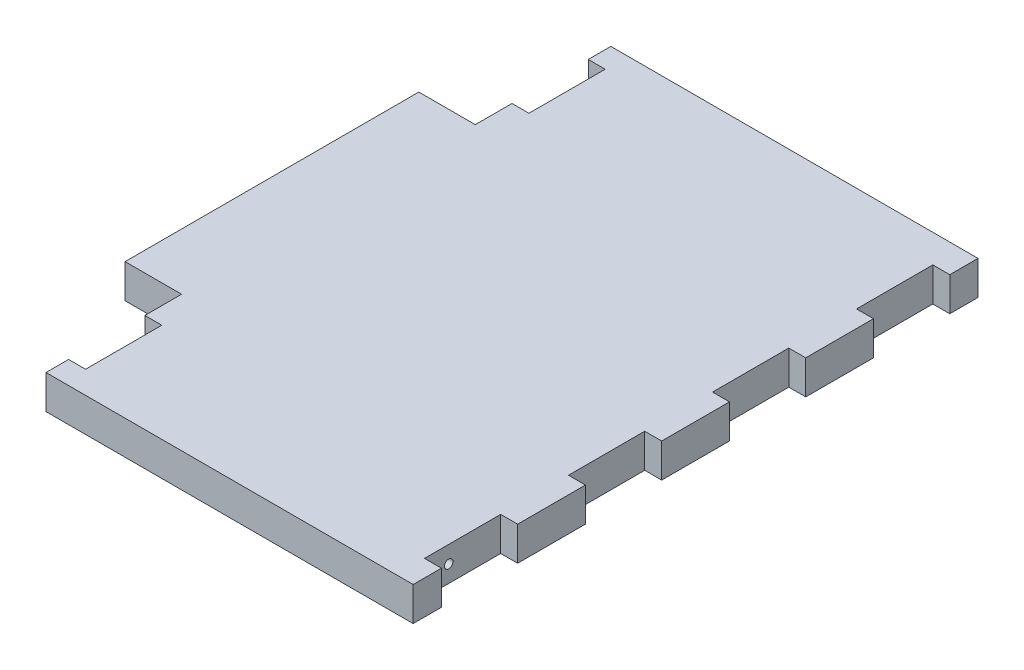
ISO-10303-21;
HEADER;
FILE_DESCRIPTION(('STEP AP214'),'2;1');
FILE_NAME('part.step','',(''),(''),'','','');
FILE_SCHEMA(('AUTOMOTIVE_DESIGN { 1 0 10303 214 1 1 1 1 }'));
ENDSEC;
DATA;
#1=APPLICATION_CONTEXT('core data for automotive mechanical design processes');
#2=APPLICATION_PROTOCOL_DEFINITION('international standard','automotive_design',2000,#1);
#3=PRODUCT_CONTEXT('',#1,'mechanical');
#4=PRODUCT('Part','Part','',(#3));
#5=PRODUCT_RELATED_PRODUCT_CATEGORY('part','',(#4));
#6=PRODUCT_DEFINITION_FORMATION('','',#4);
#7=PRODUCT_DEFINITION_CONTEXT('part definition',#1,'design');
#8=PRODUCT_DEFINITION('design','',#6,#7);
#9=PRODUCT_DEFINITION_SHAPE('','',#8);
#10=(LENGTH_UNIT() NAMED_UNIT(*) SI_UNIT(.MILLI.,.METRE.));
#11=(NAMED_UNIT(*) PLANE_ANGLE_UNIT() SI_UNIT($,.RADIAN.));
#12=(NAMED_UNIT(*) SI_UNIT($,.STERADIAN.) SOLID_ANGLE_UNIT());
#13=UNCERTAINTY_MEASURE_WITH_UNIT(LENGTH_MEASURE(1.E-05),#10,'distance_accuracy_value','');
#14=(GEOMETRIC_REPRESENTATION_CONTEXT(3) GLOBAL_UNCERTAINTY_ASSIGNED_CONTEXT((#13)) GLOBAL_UNIT_ASSIGNED_CONTEXT((#10,
#11,#12)) REPRESENTATION_CONTEXT('',''));
#15=CARTESIAN_POINT('',(0.,0.,0.));
#16=DIRECTION('',(0.,0.,1.));
#17=DIRECTION('',(1.,0.,0.));
#18=AXIS2_PLACEMENT_3D('',#15,#16,#17);
#19=CARTESIAN_POINT('',(40.,6.,38.));
#20=DIRECTION('',(-1.,0.,0.));
#21=DIRECTION('',(0.,0.,1.));
#22=AXIS2_PLACEMENT_3D('',#19,#20,#21);
#23=PLANE('',#22);
#24=DIRECTION('',(0.,0.,-1.));
#25=VECTOR('',#24,1.);
#26=CARTESIAN_POINT('',(40.,6.,38.));
#27=LINE('',#26,#25);
#28=CARTESIAN_POINT('',(40.,6.,-31.5));
#29=VERTEX_POINT('',#28);
#30=CARTESIAN_POINT('',(40.,6.,-43.5));
#31=VERTEX_POINT('',#30);
#32=EDGE_CURVE('E393',#29,#31,#27,.T.);
#33=ORIENTED_EDGE('',*,*,#32,.F.);
#34=DIRECTION('',(0.,-1.,0.));
#35=VECTOR('',#34,1.);
#36=CARTESIAN_POINT('',(40.,6.,-31.5));
#37=LINE('',#36,#35);
#38=CARTESIAN_POINT('',(40.,0.,-31.5));
#39=VERTEX_POINT('',#38);
#40=EDGE_CURVE('E425',#29,#39,#37,.T.);
#41=ORIENTED_EDGE('',*,*,#40,.T.);
#42=DIRECTION('',(0.,0.,-1.));
#43=VECTOR('',#42,1.);
#44=CARTESIAN_POINT('',(40.,0.,38.));
#45=LINE('',#44,#43);
#46=CARTESIAN_POINT('',(40.,0.,-43.5));
#47=VERTEX_POINT('',#46);
#48=EDGE_CURVE('E279',#39,#47,#45,.T.);
#49=ORIENTED_EDGE('',*,*,#48,.T.);
#50=DIRECTION('',(0.,1.,0.));
#51=VECTOR('',#50,1.);
#52=CARTESIAN_POINT('',(40.,6.,-43.5));
#53=LINE('',#52,#51);
#54=EDGE_CURVE('E308',#47,#31,#53,.T.);
#55=ORIENTED_EDGE('',*,*,#54,.T.);
#56=EDGE_LOOP('',(#33,#41,#49,#55));
#57=FACE_BOUND('',#56,.T.);
#58=ADVANCED_FACE('F31',(#57),#23,.F.);
#59=CARTESIAN_POINT('',(40.,6.,-57.));
#60=VERTEX_POINT('',#59);
#61=CARTESIAN_POINT('',(40.,6.,-62.));
#62=VERTEX_POINT('',#61);
#63=EDGE_CURVE('E285',#60,#62,#27,.T.);
#64=ORIENTED_EDGE('',*,*,#63,.F.);
#65=DIRECTION('',(0.,-1.,0.));
#66=VECTOR('',#65,1.);
#67=CARTESIAN_POINT('',(40.,6.,-57.));
#68=LINE('',#67,#66);
#69=CARTESIAN_POINT('',(40.,0.,-57.));
#70=VERTEX_POINT('',#69);
#71=EDGE_CURVE('E337',#60,#70,#68,.T.);
#72=ORIENTED_EDGE('',*,*,#71,.T.);
#73=CARTESIAN_POINT('',(40.,0.,-62.));
#74=VERTEX_POINT('',#73);
#75=EDGE_CURVE('E390',#70,#74,#45,.T.);
#76=ORIENTED_EDGE('',*,*,#75,.T.);
#77=DIRECTION('',(0.,-1.,0.));
#78=VECTOR('',#77,1.);
#79=CARTESIAN_POINT('',(40.,6.,-62.));
#80=LINE('',#79,#78);
#81=EDGE_CURVE('E288',#62,#74,#80,.T.);
#82=ORIENTED_EDGE('',*,*,#81,.F.);
#83=EDGE_LOOP('',(#64,#72,#76,#82));
#84=FACE_BOUND('',#83,.T.);
#85=ADVANCED_FACE('F410',(#84),#23,.F.);
#86=CARTESIAN_POINT('',(40.,0.,-6.00000000000001));
#87=VERTEX_POINT('',#86);
#88=CARTESIAN_POINT('',(40.,0.,-18.));
#89=VERTEX_POINT('',#88);
#90=EDGE_CURVE('E412',#87,#89,#45,.T.);
#91=ORIENTED_EDGE('',*,*,#90,.T.);
#92=DIRECTION('',(0.,1.,0.));
#93=VECTOR('',#92,1.);
#94=CARTESIAN_POINT('',(40.,6.,-18.));
#95=LINE('',#94,#93);
#96=CARTESIAN_POINT('',(40.,6.,-18.));
#97=VERTEX_POINT('',#96);
#98=EDGE_CURVE('E53',#89,#97,#95,.T.);
#99=ORIENTED_EDGE('',*,*,#98,.T.);
#100=CARTESIAN_POINT('',(40.,6.,-6.00000000000001));
#101=VERTEX_POINT('',#100);
#102=EDGE_CURVE('E396',#101,#97,#27,.T.);
#103=ORIENTED_EDGE('',*,*,#102,.F.);
#104=DIRECTION('',(0.,-1.,0.));
#105=VECTOR('',#104,1.);
#106=CARTESIAN_POINT('',(40.,6.,-6.00000000000001));
#107=LINE('',#106,#105);
#108=EDGE_CURVE('E362',#101,#87,#107,.T.);
#109=ORIENTED_EDGE('',*,*,#108,.T.);
#110=EDGE_LOOP('',(#91,#99,#103,#109));
#111=FACE_BOUND('',#110,.T.);
#112=ADVANCED_FACE('F597',(#111),#23,.F.);
#113=CARTESIAN_POINT('',(40.,0.,38.));
#114=VERTEX_POINT('',#113);
#115=CARTESIAN_POINT('',(40.,0.,33.));
#116=VERTEX_POINT('',#115);
#117=EDGE_CURVE('E274',#114,#116,#45,.T.);
#118=ORIENTED_EDGE('',*,*,#117,.T.);
#119=DIRECTION('',(0.,1.,0.));
#120=VECTOR('',#119,1.);
#121=CARTESIAN_POINT('',(40.,6.,33.));
#122=LINE('',#121,#120);
#123=CARTESIAN_POINT('',(40.,6.,33.));
#124=VERTEX_POINT('',#123);
#125=EDGE_CURVE('E385',#116,#124,#122,.T.);
#126=ORIENTED_EDGE('',*,*,#125,.T.);
#127=CARTESIAN_POINT('',(40.,6.,38.));
#128=VERTEX_POINT('',#127);
#129=EDGE_CURVE('E270',#128,#124,#27,.T.);
#130=ORIENTED_EDGE('',*,*,#129,.F.);
#131=DIRECTION('',(0.,-1.,0.));
#132=VECTOR('',#131,1.);
#133=CARTESIAN_POINT('',(40.,6.,38.));
#134=LINE('',#133,#132);
#135=EDGE_CURVE('E267',#128,#114,#134,.T.);
#136=ORIENTED_EDGE('',*,*,#135,.T.);
#137=EDGE_LOOP('',(#118,#126,#130,#136));
#138=FACE_BOUND('',#137,.T.);
#139=ADVANCED_FACE('F483',(#138),#23,.F.);
#140=CARTESIAN_POINT('',(40.,0.,19.5));
#141=VERTEX_POINT('',#140);
#142=CARTESIAN_POINT('',(40.,0.,7.49999999999999));
#143=VERTEX_POINT('',#142);
#144=EDGE_CURVE('E278',#141,#143,#45,.T.);
#145=ORIENTED_EDGE('',*,*,#144,.T.);
#146=DIRECTION('',(0.,1.,0.));
#147=VECTOR('',#146,1.);
#148=CARTESIAN_POINT('',(40.,6.,7.49999999999999));
#149=LINE('',#148,#147);
#150=CARTESIAN_POINT('',(40.,6.,7.49999999999999));
#151=VERTEX_POINT('',#150);
#152=EDGE_CURVE('E357',#143,#151,#149,.T.);
#153=ORIENTED_EDGE('',*,*,#152,.T.);
#154=CARTESIAN_POINT('',(40.,6.,19.5));
#155=VERTEX_POINT('',#154);
#156=EDGE_CURVE('E392',#155,#151,#27,.T.);
#157=ORIENTED_EDGE('',*,*,#156,.F.);
#158=DIRECTION('',(0.,-1.,0.));
#159=VECTOR('',#158,1.);
#160=CARTESIAN_POINT('',(40.,6.,19.5));
#161=LINE('',#160,#159);
#162=EDGE_CURVE('E295',#155,#141,#161,.T.);
#163=ORIENTED_EDGE('',*,*,#162,.T.);
#164=EDGE_LOOP('',(#145,#153,#157,#163));
#165=FACE_BOUND('',#164,.T.);
#166=ADVANCED_FACE('F33',(#165),#23,.F.);
#167=CARTESIAN_POINT('',(-35.,6.,-62.));
#168=DIRECTION('',(0.,0.,1.));
#169=DIRECTION('',(1.,0.,0.));
#170=AXIS2_PLACEMENT_3D('',#167,#168,#169);
#171=PLANE('',#170);
#172=DIRECTION('',(-1.,0.,0.));
#173=VECTOR('',#172,1.);
#174=CARTESIAN_POINT('',(-35.,0.,-62.));
#175=LINE('',#174,#173);
#176=CARTESIAN_POINT('',(-25.0000000001165,0.,-62.));
#177=VERTEX_POINT('',#176);
#178=EDGE_CURVE('E277',#74,#177,#175,.T.);
#179=ORIENTED_EDGE('',*,*,#178,.T.);
#180=DIRECTION('',(0.,-1.,0.));
#181=VECTOR('',#180,1.);
#182=CARTESIAN_POINT('',(-25.0000000001165,6.,-62.));
#183=LINE('',#182,#181);
#184=CARTESIAN_POINT('',(-25.0000000001165,6.,-62.));
#185=VERTEX_POINT('',#184);
#186=EDGE_CURVE('E409',#185,#177,#183,.T.);
#187=ORIENTED_EDGE('',*,*,#186,.F.);
#188=DIRECTION('',(-1.,0.,0.));
#189=VECTOR('',#188,1.);
#190=CARTESIAN_POINT('',(-35.,6.,-62.));
#191=LINE('',#190,#189);
#192=EDGE_CURVE('E265',#62,#185,#191,.T.);
#193=ORIENTED_EDGE('',*,*,#192,.F.);
#194=ORIENTED_EDGE('',*,*,#81,.T.);
#195=EDGE_LOOP('',(#179,#187,#193,#194));
#196=FACE_BOUND('',#195,.T.);
#197=ADVANCED_FACE('F408',(#196),#171,.F.);
#198=CARTESIAN_POINT('',(-35.,6.,38.));
#199=DIRECTION('',(1.,0.,0.));
#200=DIRECTION('',(0.,0.,-1.));
#201=AXIS2_PLACEMENT_3D('',#198,#199,#200);
#202=PLANE('',#201);
#203=DIRECTION('',(0.,0.,1.));
#204=VECTOR('',#203,1.);
#205=CARTESIAN_POINT('',(-35.,0.,38.));
#206=LINE('',#205,#204);
#207=CARTESIAN_POINT('',(-35.0000000001165,0.,-38.));
#208=VERTEX_POINT('',#207);
#209=CARTESIAN_POINT('',(-35.,0.,14.));
#210=VERTEX_POINT('',#209);
#211=EDGE_CURVE('E255',#208,#210,#206,.T.);
#212=ORIENTED_EDGE('',*,*,#211,.T.);
#213=DIRECTION('',(0.,-1.,0.));
#214=VECTOR('',#213,1.);
#215=CARTESIAN_POINT('',(-35.0000000001165,6.,14.));
#216=LINE('',#215,#214);
#217=CARTESIAN_POINT('',(-35.0000000001165,6.,14.));
#218=VERTEX_POINT('',#217);
#219=EDGE_CURVE('E46',#218,#210,#216,.T.);
#220=ORIENTED_EDGE('',*,*,#219,.F.);
#221=DIRECTION('',(0.,0.,1.));
#222=VECTOR('',#221,1.);
#223=CARTESIAN_POINT('',(-35.,6.,38.));
#224=LINE('',#223,#222);
#225=CARTESIAN_POINT('',(-35.0000000001165,6.,-38.));
#226=VERTEX_POINT('',#225);
#227=EDGE_CURVE('E253',#226,#218,#224,.T.);
#228=ORIENTED_EDGE('',*,*,#227,.F.);
#229=DIRECTION('',(0.,-1.,0.));
#230=VECTOR('',#229,1.);
#231=CARTESIAN_POINT('',(-35.0000000001165,6.,-38.));
#232=LINE('',#231,#230);
#233=EDGE_CURVE('E447',#226,#208,#232,.T.);
#234=ORIENTED_EDGE('',*,*,#233,.T.);
#235=EDGE_LOOP('',(#212,#220,#228,#234));
#236=FACE_BOUND('',#235,.T.);
#237=ADVANCED_FACE('F251',(#236),#202,.F.);
#238=CARTESIAN_POINT('',(-35.,6.,38.));
#239=DIRECTION('',(0.,0.,-1.));
#240=DIRECTION('',(-1.,0.,0.));
#241=AXIS2_PLACEMENT_3D('',#238,#239,#240);
#242=PLANE('',#241);
#243=DIRECTION('',(1.,0.,0.));
#244=VECTOR('',#243,1.);
#245=CARTESIAN_POINT('',(-35.,6.,38.));
#246=LINE('',#245,#244);
#247=CARTESIAN_POINT('',(-25.0000000001165,6.,38.));
#248=VERTEX_POINT('',#247);
#249=EDGE_CURVE('E264',#248,#128,#246,.T.);
#250=ORIENTED_EDGE('',*,*,#249,.F.);
#251=DIRECTION('',(0.,-1.,0.));
#252=VECTOR('',#251,1.);
#253=CARTESIAN_POINT('',(-25.0000000001165,6.,38.));
#254=LINE('',#253,#252);
#255=CARTESIAN_POINT('',(-25.0000000001165,0.,38.));
#256=VERTEX_POINT('',#255);
#257=EDGE_CURVE('E489',#248,#256,#254,.T.);
#258=ORIENTED_EDGE('',*,*,#257,.T.);
#259=DIRECTION('',(1.,0.,0.));
#260=VECTOR('',#259,1.);
#261=CARTESIAN_POINT('',(-35.,0.,38.));
#262=LINE('',#261,#260);
#263=EDGE_CURVE('E283',#256,#114,#262,.T.);
#264=ORIENTED_EDGE('',*,*,#263,.T.);
#265=ORIENTED_EDGE('',*,*,#135,.F.);
#266=EDGE_LOOP('',(#250,#258,#264,#265));
#267=FACE_BOUND('',#266,.T.);
#268=ADVANCED_FACE('F487',(#267),#242,.F.);
#269=CARTESIAN_POINT('',(40.,6.,-62.));
#270=DIRECTION('',(0.,-1.,0.));
#271=DIRECTION('',(0.,0.,-1.));
#272=AXIS2_PLACEMENT_3D('',#269,#270,#271);
#273=PLANE('',#272);
#274=DIRECTION('',(-1.,0.,0.));
#275=VECTOR('',#274,1.);
#276=CARTESIAN_POINT('',(-25.0000000001165,6.,34.));
#277=LINE('',#276,#275);
#278=CARTESIAN_POINT('',(-22.0000000001165,6.,34.));
#279=VERTEX_POINT('',#278);
#280=CARTESIAN_POINT('',(-25.0000000001165,6.,34.));
#281=VERTEX_POINT('',#280);
#282=EDGE_CURVE('E578',#279,#281,#277,.T.);
#283=ORIENTED_EDGE('',*,*,#282,.T.);
#284=DIRECTION('',(0.,0.,1.));
#285=VECTOR('',#284,1.);
#286=CARTESIAN_POINT('',(-25.0000000001165,6.,34.));
#287=LINE('',#286,#285);
#288=EDGE_CURVE('E256',#281,#248,#287,.T.);
#289=ORIENTED_EDGE('',*,*,#288,.T.);
#290=ORIENTED_EDGE('',*,*,#249,.T.);
#291=ORIENTED_EDGE('',*,*,#129,.T.);
#292=DIRECTION('',(-1.,0.,0.));
#293=VECTOR('',#292,1.);
#294=CARTESIAN_POINT('',(37.,6.,33.));
#295=LINE('',#294,#293);
#296=CARTESIAN_POINT('',(37.,6.,33.));
#297=VERTEX_POINT('',#296);
#298=EDGE_CURVE('E373',#124,#297,#295,.T.);
#299=ORIENTED_EDGE('',*,*,#298,.T.);
#300=DIRECTION('',(0.,0.,-1.));
#301=VECTOR('',#300,1.);
#302=CARTESIAN_POINT('',(37.,6.,33.));
#303=LINE('',#302,#301);
#304=CARTESIAN_POINT('',(37.,6.,19.5));
#305=VERTEX_POINT('',#304);
#306=EDGE_CURVE('E366',#297,#305,#303,.T.);
#307=ORIENTED_EDGE('',*,*,#306,.T.);
#308=DIRECTION('',(1.,0.,0.));
#309=VECTOR('',#308,1.);
#310=CARTESIAN_POINT('',(37.,6.,19.5));
#311=LINE('',#310,#309);
#312=EDGE_CURVE('E369',#305,#155,#311,.T.);
#313=ORIENTED_EDGE('',*,*,#312,.T.);
#314=ORIENTED_EDGE('',*,*,#156,.T.);
#315=DIRECTION('',(-1.,0.,0.));
#316=VECTOR('',#315,1.);
#317=CARTESIAN_POINT('',(49.8374630247994,6.,7.49999999999999));
#318=LINE('',#317,#316);
#319=CARTESIAN_POINT('',(37.,6.,7.49999999999999));
#320=VERTEX_POINT('',#319);
#321=EDGE_CURVE('E341',#151,#320,#318,.T.);
#322=ORIENTED_EDGE('',*,*,#321,.T.);
#323=DIRECTION('',(0.,0.,-1.));
#324=VECTOR('',#323,1.);
#325=CARTESIAN_POINT('',(37.,6.,-6.00000000000001));
#326=LINE('',#325,#324);
#327=CARTESIAN_POINT('',(37.,6.,-6.00000000000001));
#328=VERTEX_POINT('',#327);
#329=EDGE_CURVE('E344',#320,#328,#326,.T.);
#330=ORIENTED_EDGE('',*,*,#329,.T.);
#331=DIRECTION('',(1.,0.,0.));
#332=VECTOR('',#331,1.);
#333=CARTESIAN_POINT('',(49.8374630247994,6.,-6.00000000000001));
#334=LINE('',#333,#332);
#335=EDGE_CURVE('E348',#328,#101,#334,.T.);
#336=ORIENTED_EDGE('',*,*,#335,.T.);
#337=ORIENTED_EDGE('',*,*,#102,.T.);
#338=DIRECTION('',(-1.,0.,0.));
#339=VECTOR('',#338,1.);
#340=CARTESIAN_POINT('',(49.8374630247994,6.,-18.));
#341=LINE('',#340,#339);
#342=CARTESIAN_POINT('',(37.,6.,-18.));
#343=VERTEX_POINT('',#342);
#344=EDGE_CURVE('E511',#97,#343,#341,.T.);
#345=ORIENTED_EDGE('',*,*,#344,.T.);
#346=DIRECTION('',(0.,0.,-1.));
#347=VECTOR('',#346,1.);
#348=CARTESIAN_POINT('',(37.,6.,-31.5));
#349=LINE('',#348,#347);
#350=CARTESIAN_POINT('',(37.,6.,-31.5));
#351=VERTEX_POINT('',#350);
#352=EDGE_CURVE('E514',#343,#351,#349,.T.);
#353=ORIENTED_EDGE('',*,*,#352,.T.);
#354=DIRECTION('',(1.,0.,0.));
#355=VECTOR('',#354,1.);
#356=CARTESIAN_POINT('',(49.8374630247994,6.,-31.5));
#357=LINE('',#356,#355);
#358=EDGE_CURVE('E518',#351,#29,#357,.T.);
#359=ORIENTED_EDGE('',*,*,#358,.T.);
#360=ORIENTED_EDGE('',*,*,#32,.T.);
#361=DIRECTION('',(-1.,0.,0.));
#362=VECTOR('',#361,1.);
#363=CARTESIAN_POINT('',(37.,6.,-43.5));
#364=LINE('',#363,#362);
#365=CARTESIAN_POINT('',(37.,6.,-43.5));
#366=VERTEX_POINT('',#365);
#367=EDGE_CURVE('E329',#31,#366,#364,.T.);
#368=ORIENTED_EDGE('',*,*,#367,.T.);
#369=DIRECTION('',(0.,0.,-1.));
#370=VECTOR('',#369,1.);
#371=CARTESIAN_POINT('',(37.,6.,-57.));
#372=LINE('',#371,#370);
#373=CARTESIAN_POINT('',(37.,6.,-57.));
#374=VERTEX_POINT('',#373);
#375=EDGE_CURVE('E318',#366,#374,#372,.T.);
#376=ORIENTED_EDGE('',*,*,#375,.T.);
#377=DIRECTION('',(1.,0.,0.));
#378=VECTOR('',#377,1.);
#379=CARTESIAN_POINT('',(37.,6.,-57.));
#380=LINE('',#379,#378);
#381=EDGE_CURVE('E326',#374,#60,#380,.T.);
#382=ORIENTED_EDGE('',*,*,#381,.T.);
#383=ORIENTED_EDGE('',*,*,#63,.T.);
#384=ORIENTED_EDGE('',*,*,#192,.T.);
#385=DIRECTION('',(0.,0.,1.));
#386=VECTOR('',#385,1.);
#387=CARTESIAN_POINT('',(-25.0000000001165,6.,-58.));
#388=LINE('',#387,#386);
#389=CARTESIAN_POINT('',(-25.0000000001165,6.,-58.));
#390=VERTEX_POINT('',#389);
#391=EDGE_CURVE('E531',#185,#390,#388,.T.);
#392=ORIENTED_EDGE('',*,*,#391,.T.);
#393=DIRECTION('',(1.,0.,0.));
#394=VECTOR('',#393,1.);
#395=CARTESIAN_POINT('',(-25.0000000001165,6.,-58.));
#396=LINE('',#395,#394);
#397=CARTESIAN_POINT('',(-22.0000000001165,6.,-58.));
#398=VERTEX_POINT('',#397);
#399=EDGE_CURVE('E533',#390,#398,#396,.T.);
#400=ORIENTED_EDGE('',*,*,#399,.T.);
#401=DIRECTION('',(0.,0.,1.));
#402=VECTOR('',#401,1.);
#403=CARTESIAN_POINT('',(-22.0000000001165,6.,-44.5));
#404=LINE('',#403,#402);
#405=CARTESIAN_POINT('',(-22.0000000001165,6.,-44.5));
#406=VERTEX_POINT('',#405);
#407=EDGE_CURVE('E536',#398,#406,#404,.T.);
#408=ORIENTED_EDGE('',*,*,#407,.T.);
#409=DIRECTION('',(-1.,0.,0.));
#410=VECTOR('',#409,1.);
#411=CARTESIAN_POINT('',(-25.0000000001165,6.,-44.5));
#412=LINE('',#411,#410);
#413=CARTESIAN_POINT('',(-25.0000000001165,6.,-44.5));
#414=VERTEX_POINT('',#413);
#415=EDGE_CURVE('E539',#406,#414,#412,.T.);
#416=ORIENTED_EDGE('',*,*,#415,.T.);
#417=DIRECTION('',(0.,0.,1.));
#418=VECTOR('',#417,1.);
#419=CARTESIAN_POINT('',(-25.0000000001165,6.,-38.));
#420=LINE('',#419,#418);
#421=CARTESIAN_POINT('',(-25.0000000001165,6.,-38.));
#422=VERTEX_POINT('',#421);
#423=EDGE_CURVE('E448',#414,#422,#420,.T.);
#424=ORIENTED_EDGE('',*,*,#423,.T.);
#425=DIRECTION('',(-1.,0.,0.));
#426=VECTOR('',#425,1.);
#427=CARTESIAN_POINT('',(-35.0000000001165,6.,-38.));
#428=LINE('',#427,#426);
#429=EDGE_CURVE('E263',#422,#226,#428,.T.);
#430=ORIENTED_EDGE('',*,*,#429,.T.);
#431=ORIENTED_EDGE('',*,*,#227,.T.);
#432=DIRECTION('',(1.,0.,0.));
#433=VECTOR('',#432,1.);
#434=CARTESIAN_POINT('',(-35.0000000001165,6.,14.));
#435=LINE('',#434,#433);
#436=CARTESIAN_POINT('',(-25.0000000001165,6.,14.));
#437=VERTEX_POINT('',#436);
#438=EDGE_CURVE('E238',#218,#437,#435,.T.);
#439=ORIENTED_EDGE('',*,*,#438,.T.);
#440=DIRECTION('',(0.,0.,1.));
#441=VECTOR('',#440,1.);
#442=CARTESIAN_POINT('',(-25.0000000001165,6.,14.));
#443=LINE('',#442,#441);
#444=CARTESIAN_POINT('',(-25.0000000001165,6.,20.5));
#445=VERTEX_POINT('',#444);
#446=EDGE_CURVE('E245',#437,#445,#443,.T.);
#447=ORIENTED_EDGE('',*,*,#446,.T.);
#448=DIRECTION('',(1.,0.,0.));
#449=VECTOR('',#448,1.);
#450=CARTESIAN_POINT('',(-25.0000000001165,6.,20.5));
#451=LINE('',#450,#449);
#452=CARTESIAN_POINT('',(-22.0000000001165,6.,20.5));
#453=VERTEX_POINT('',#452);
#454=EDGE_CURVE('E570',#445,#453,#451,.T.);
#455=ORIENTED_EDGE('',*,*,#454,.T.);
#456=DIRECTION('',(0.,0.,1.));
#457=VECTOR('',#456,1.);
#458=CARTESIAN_POINT('',(-22.0000000001165,6.,20.5));
#459=LINE('',#458,#457);
#460=EDGE_CURVE('E574',#453,#279,#459,.T.);
#461=ORIENTED_EDGE('',*,*,#460,.T.);
#462=EDGE_LOOP('',(#283,#289,#290,#291,#299,#307,#313,#314,#322,#330,#336,#337,#345,#353,#359,
#360,#368,#376,#382,#383,#384,#392,#400,#408,#416,#424,#430,#431,#439,#447,#455,#461));
#463=FACE_BOUND('',#462,.T.);
#464=ADVANCED_FACE('F260',(#463),#273,.F.);
#465=CARTESIAN_POINT('',(40.,0.,-62.));
#466=DIRECTION('',(0.,-1.,0.));
#467=DIRECTION('',(0.,0.,-1.));
#468=AXIS2_PLACEMENT_3D('',#465,#466,#467);
#469=PLANE('',#468);
#470=DIRECTION('',(0.,0.,1.));
#471=VECTOR('',#470,1.);
#472=CARTESIAN_POINT('',(-25.0000000001165,0.,34.));
#473=LINE('',#472,#471);
#474=CARTESIAN_POINT('',(-25.0000000001165,0.,34.));
#475=VERTEX_POINT('',#474);
#476=EDGE_CURVE('E246',#475,#256,#473,.T.);
#477=ORIENTED_EDGE('',*,*,#476,.F.);
#478=DIRECTION('',(-1.,0.,0.));
#479=VECTOR('',#478,1.);
#480=CARTESIAN_POINT('',(-25.0000000001165,0.,34.));
#481=LINE('',#480,#479);
#482=CARTESIAN_POINT('',(-22.0000000001165,0.,34.));
#483=VERTEX_POINT('',#482);
#484=EDGE_CURVE('E493',#483,#475,#481,.T.);
#485=ORIENTED_EDGE('',*,*,#484,.F.);
#486=DIRECTION('',(0.,0.,1.));
#487=VECTOR('',#486,1.);
#488=CARTESIAN_POINT('',(-22.0000000001165,0.,20.5));
#489=LINE('',#488,#487);
#490=CARTESIAN_POINT('',(-22.0000000001165,0.,20.5));
#491=VERTEX_POINT('',#490);
#492=EDGE_CURVE('E496',#491,#483,#489,.T.);
#493=ORIENTED_EDGE('',*,*,#492,.F.);
#494=DIRECTION('',(1.,0.,0.));
#495=VECTOR('',#494,1.);
#496=CARTESIAN_POINT('',(-25.0000000001165,0.,20.5));
#497=LINE('',#496,#495);
#498=CARTESIAN_POINT('',(-25.0000000001165,0.,20.5));
#499=VERTEX_POINT('',#498);
#500=EDGE_CURVE('E555',#499,#491,#497,.T.);
#501=ORIENTED_EDGE('',*,*,#500,.F.);
#502=DIRECTION('',(0.,0.,1.));
#503=VECTOR('',#502,1.);
#504=CARTESIAN_POINT('',(-25.0000000001165,0.,14.));
#505=LINE('',#504,#503);
#506=CARTESIAN_POINT('',(-25.0000000001165,0.,14.));
#507=VERTEX_POINT('',#506);
#508=EDGE_CURVE('E553',#507,#499,#505,.T.);
#509=ORIENTED_EDGE('',*,*,#508,.F.);
#510=DIRECTION('',(1.,0.,0.));
#511=VECTOR('',#510,1.);
#512=CARTESIAN_POINT('',(-35.0000000001165,0.,14.));
#513=LINE('',#512,#511);
#514=EDGE_CURVE('E550',#210,#507,#513,.T.);
#515=ORIENTED_EDGE('',*,*,#514,.F.);
#516=ORIENTED_EDGE('',*,*,#211,.F.);
#517=DIRECTION('',(-1.,0.,0.));
#518=VECTOR('',#517,1.);
#519=CARTESIAN_POINT('',(-35.0000000001165,0.,-38.));
#520=LINE('',#519,#518);
#521=CARTESIAN_POINT('',(-25.0000000001165,0.,-38.));
#522=VERTEX_POINT('',#521);
#523=EDGE_CURVE('E421',#522,#208,#520,.T.);
#524=ORIENTED_EDGE('',*,*,#523,.F.);
#525=DIRECTION('',(0.,0.,1.));
#526=VECTOR('',#525,1.);
#527=CARTESIAN_POINT('',(-25.0000000001165,0.,-38.));
#528=LINE('',#527,#526);
#529=CARTESIAN_POINT('',(-25.0000000001165,0.,-44.5));
#530=VERTEX_POINT('',#529);
#531=EDGE_CURVE('E434',#530,#522,#528,.T.);
#532=ORIENTED_EDGE('',*,*,#531,.F.);
#533=DIRECTION('',(-1.,0.,0.));
#534=VECTOR('',#533,1.);
#535=CARTESIAN_POINT('',(-25.0000000001165,0.,-44.5));
#536=LINE('',#535,#534);
#537=CARTESIAN_POINT('',(-22.0000000001165,0.,-44.5));
#538=VERTEX_POINT('',#537);
#539=EDGE_CURVE('E431',#538,#530,#536,.T.);
#540=ORIENTED_EDGE('',*,*,#539,.F.);
#541=DIRECTION('',(0.,0.,1.));
#542=VECTOR('',#541,1.);
#543=CARTESIAN_POINT('',(-22.0000000001165,0.,-44.5));
#544=LINE('',#543,#542);
#545=CARTESIAN_POINT('',(-22.0000000001165,0.,-58.));
#546=VERTEX_POINT('',#545);
#547=EDGE_CURVE('E423',#546,#538,#544,.T.);
#548=ORIENTED_EDGE('',*,*,#547,.F.);
#549=DIRECTION('',(1.,0.,0.));
#550=VECTOR('',#549,1.);
#551=CARTESIAN_POINT('',(-25.0000000001165,0.,-58.));
#552=LINE('',#551,#550);
#553=CARTESIAN_POINT('',(-25.0000000001165,0.,-58.));
#554=VERTEX_POINT('',#553);
#555=EDGE_CURVE('E419',#554,#546,#552,.T.);
#556=ORIENTED_EDGE('',*,*,#555,.F.);
#557=DIRECTION('',(0.,0.,1.));
#558=VECTOR('',#557,1.);
#559=CARTESIAN_POINT('',(-25.0000000001165,0.,-58.));
#560=LINE('',#559,#558);
#561=EDGE_CURVE('E416',#177,#554,#560,.T.);
#562=ORIENTED_EDGE('',*,*,#561,.F.);
#563=ORIENTED_EDGE('',*,*,#178,.F.);
#564=ORIENTED_EDGE('',*,*,#75,.F.);
#565=DIRECTION('',(1.,0.,0.));
#566=VECTOR('',#565,1.);
#567=CARTESIAN_POINT('',(37.,0.,-57.));
#568=LINE('',#567,#566);
#569=CARTESIAN_POINT('',(37.,0.,-57.));
#570=VERTEX_POINT('',#569);
#571=EDGE_CURVE('E325',#570,#70,#568,.T.);
#572=ORIENTED_EDGE('',*,*,#571,.F.);
#573=DIRECTION('',(0.,0.,-1.));
#574=VECTOR('',#573,1.);
#575=CARTESIAN_POINT('',(37.,0.,-57.));
#576=LINE('',#575,#574);
#577=CARTESIAN_POINT('',(37.,0.,-43.5));
#578=VERTEX_POINT('',#577);
#579=EDGE_CURVE('E315',#578,#570,#576,.T.);
#580=ORIENTED_EDGE('',*,*,#579,.F.);
#581=DIRECTION('',(-1.,0.,0.));
#582=VECTOR('',#581,1.);
#583=CARTESIAN_POINT('',(40.,0.,-43.5));
#584=LINE('',#583,#582);
#585=EDGE_CURVE('E39',#47,#578,#584,.T.);
#586=ORIENTED_EDGE('',*,*,#585,.F.);
#587=ORIENTED_EDGE('',*,*,#48,.F.);
#588=DIRECTION('',(1.,0.,0.));
#589=VECTOR('',#588,1.);
#590=CARTESIAN_POINT('',(49.8374630247994,0.,-31.5));
#591=LINE('',#590,#589);
#592=CARTESIAN_POINT('',(37.,0.,-31.5));
#593=VERTEX_POINT('',#592);
#594=EDGE_CURVE('E515',#593,#39,#591,.T.);
#595=ORIENTED_EDGE('',*,*,#594,.F.);
#596=DIRECTION('',(0.,0.,-1.));
#597=VECTOR('',#596,1.);
#598=CARTESIAN_POINT('',(37.,0.,-31.5));
#599=LINE('',#598,#597);
#600=CARTESIAN_POINT('',(37.,0.,-18.));
#601=VERTEX_POINT('',#600);
#602=EDGE_CURVE('E501',#601,#593,#599,.T.);
#603=ORIENTED_EDGE('',*,*,#602,.F.);
#604=DIRECTION('',(-1.,0.,0.));
#605=VECTOR('',#604,1.);
#606=CARTESIAN_POINT('',(40.,0.,-18.));
#607=LINE('',#606,#605);
#608=EDGE_CURVE('E11',#89,#601,#607,.T.);
#609=ORIENTED_EDGE('',*,*,#608,.F.);
#610=ORIENTED_EDGE('',*,*,#90,.F.);
#611=DIRECTION('',(1.,0.,0.));
#612=VECTOR('',#611,1.);
#613=CARTESIAN_POINT('',(49.8374630247994,0.,-6.00000000000001));
#614=LINE('',#613,#612);
#615=CARTESIAN_POINT('',(37.,0.,-6.00000000000001));
#616=VERTEX_POINT('',#615);
#617=EDGE_CURVE('E345',#616,#87,#614,.T.);
#618=ORIENTED_EDGE('',*,*,#617,.F.);
#619=DIRECTION('',(0.,0.,-1.));
#620=VECTOR('',#619,1.);
#621=CARTESIAN_POINT('',(37.,0.,-6.00000000000001));
#622=LINE('',#621,#620);
#623=CARTESIAN_POINT('',(37.,0.,7.49999999999999));
#624=VERTEX_POINT('',#623);
#625=EDGE_CURVE('E340',#624,#616,#622,.T.);
#626=ORIENTED_EDGE('',*,*,#625,.F.);
#627=DIRECTION('',(-1.,0.,0.));
#628=VECTOR('',#627,1.);
#629=CARTESIAN_POINT('',(40.,0.,7.49999999999999));
#630=LINE('',#629,#628);
#631=EDGE_CURVE('E298',#143,#624,#630,.T.);
#632=ORIENTED_EDGE('',*,*,#631,.F.);
#633=ORIENTED_EDGE('',*,*,#144,.F.);
#634=DIRECTION('',(1.,0.,0.));
#635=VECTOR('',#634,1.);
#636=CARTESIAN_POINT('',(37.,0.,19.5));
#637=LINE('',#636,#635);
#638=CARTESIAN_POINT('',(37.,0.,19.5));
#639=VERTEX_POINT('',#638);
#640=EDGE_CURVE('E370',#639,#141,#637,.T.);
#641=ORIENTED_EDGE('',*,*,#640,.F.);
#642=DIRECTION('',(0.,0.,-1.));
#643=VECTOR('',#642,1.);
#644=CARTESIAN_POINT('',(37.,0.,33.));
#645=LINE('',#644,#643);
#646=CARTESIAN_POINT('',(37.,0.,33.));
#647=VERTEX_POINT('',#646);
#648=EDGE_CURVE('E365',#647,#639,#645,.T.);
#649=ORIENTED_EDGE('',*,*,#648,.F.);
#650=DIRECTION('',(-1.,0.,0.));
#651=VECTOR('',#650,1.);
#652=CARTESIAN_POINT('',(40.,0.,33.));
#653=LINE('',#652,#651);
#654=EDGE_CURVE('E291',#116,#647,#653,.T.);
#655=ORIENTED_EDGE('',*,*,#654,.F.);
#656=ORIENTED_EDGE('',*,*,#117,.F.);
#657=ORIENTED_EDGE('',*,*,#263,.F.);
#658=EDGE_LOOP('',(#477,#485,#493,#501,#509,#515,#516,#524,#532,#540,#548,#556,#562,#563,#564,
#572,#580,#586,#587,#595,#603,#609,#610,#618,#626,#632,#633,#641,#649,#655,#656,#657));
#659=FACE_BOUND('',#658,.T.);
#660=ADVANCED_FACE('F323',(#659),#469,.T.);
#661=CARTESIAN_POINT('',(37.,6.,33.));
#662=DIRECTION('',(0.,0.,1.));
#663=DIRECTION('',(1.,0.,0.));
#664=AXIS2_PLACEMENT_3D('',#661,#662,#663);
#665=PLANE('',#664);
#666=ORIENTED_EDGE('',*,*,#654,.T.);
#667=DIRECTION('',(0.,-1.,0.));
#668=VECTOR('',#667,1.);
#669=CARTESIAN_POINT('',(37.,6.,33.));
#670=LINE('',#669,#668);
#671=EDGE_CURVE('E296',#297,#647,#670,.T.);
#672=ORIENTED_EDGE('',*,*,#671,.F.);
#673=ORIENTED_EDGE('',*,*,#298,.F.);
#674=ORIENTED_EDGE('',*,*,#125,.F.);
#675=EDGE_LOOP('',(#666,#672,#673,#674));
#676=FACE_BOUND('',#675,.T.);
#677=ADVANCED_FACE('F790',(#676),#665,.F.);
#678=CARTESIAN_POINT('',(37.,6.,19.5));
#679=DIRECTION('',(0.,0.,-1.));
#680=DIRECTION('',(-1.,0.,0.));
#681=AXIS2_PLACEMENT_3D('',#678,#679,#680);
#682=PLANE('',#681);
#683=ORIENTED_EDGE('',*,*,#312,.F.);
#684=DIRECTION('',(0.,-1.,0.));
#685=VECTOR('',#684,1.);
#686=CARTESIAN_POINT('',(37.,6.,19.5));
#687=LINE('',#686,#685);
#688=EDGE_CURVE('E376',#305,#639,#687,.T.);
#689=ORIENTED_EDGE('',*,*,#688,.T.);
#690=ORIENTED_EDGE('',*,*,#640,.T.);
#691=ORIENTED_EDGE('',*,*,#162,.F.);
#692=EDGE_LOOP('',(#683,#689,#690,#691));
#693=FACE_BOUND('',#692,.T.);
#694=ADVANCED_FACE('F474',(#693),#682,.F.);
#695=CARTESIAN_POINT('',(37.,6.,33.));
#696=DIRECTION('',(-1.,0.,0.));
#697=DIRECTION('',(0.,0.,1.));
#698=AXIS2_PLACEMENT_3D('',#695,#696,#697);
#699=PLANE('',#698);
#700=ORIENTED_EDGE('',*,*,#648,.T.);
#701=ORIENTED_EDGE('',*,*,#688,.F.);
#702=ORIENTED_EDGE('',*,*,#306,.F.);
#703=ORIENTED_EDGE('',*,*,#671,.T.);
#704=EDGE_LOOP('',(#700,#701,#702,#703));
#705=FACE_BOUND('',#704,.T.);
#706=CARTESIAN_POINT('',(37.,3.,28.7081290911999));
#707=DIRECTION('',(-1.,0.,0.));
#708=DIRECTION('',(0.,0.,1.));
#709=AXIS2_PLACEMENT_3D('',#706,#707,#708);
#710=CIRCLE('',#709,0.750000000000002);
#711=CARTESIAN_POINT('',(37.,3.,29.4581290911999));
#712=VERTEX_POINT('',#711);
#713=EDGE_CURVE('E292',#712,#712,#710,.F.);
#714=ORIENTED_EDGE('',*,*,#713,.F.);
#715=EDGE_LOOP('',(#714));
#716=FACE_BOUND('',#715,.T.);
#717=ADVANCED_FACE('F476',(#705,#716),#699,.F.);
#718=CARTESIAN_POINT('',(33.,3.,28.7081290911999));
#719=DIRECTION('',(1.,0.,0.));
#720=DIRECTION('',(0.,0.,-1.));
#721=AXIS2_PLACEMENT_3D('',#718,#719,#720);
#722=PLANE('',#721);
#723=CARTESIAN_POINT('',(33.,3.,28.7081290911999));
#724=DIRECTION('',(1.,0.,0.));
#725=DIRECTION('',(0.,0.,-1.));
#726=AXIS2_PLACEMENT_3D('',#723,#724,#725);
#727=CIRCLE('',#726,0.750000000000002);
#728=CARTESIAN_POINT('',(33.,3.,27.9581290911999));
#729=VERTEX_POINT('',#728);
#730=EDGE_CURVE('E388',#729,#729,#727,.T.);
#731=ORIENTED_EDGE('',*,*,#730,.T.);
#732=EDGE_LOOP('',(#731));
#733=FACE_BOUND('',#732,.T.);
#734=ADVANCED_FACE('F622',(#733),#722,.T.);
#735=CARTESIAN_POINT('',(33.,3.,28.7081290911999));
#736=DIRECTION('',(1.,0.,0.));
#737=DIRECTION('',(0.,0.,-1.));
#738=AXIS2_PLACEMENT_3D('',#735,#736,#737);
#739=CYLINDRICAL_SURFACE('',#738,0.750000000000002);
#740=ORIENTED_EDGE('',*,*,#713,.T.);
#741=EDGE_LOOP('',(#740));
#742=FACE_BOUND('',#741,.T.);
#743=ORIENTED_EDGE('',*,*,#730,.F.);
#744=EDGE_LOOP('',(#743));
#745=FACE_BOUND('',#744,.T.);
#746=ADVANCED_FACE('F626',(#742,#745),#739,.F.);
#747=CARTESIAN_POINT('',(49.8374630247994,6.,-6.00000000000001));
#748=DIRECTION('',(0.,0.,-1.));
#749=DIRECTION('',(-1.,0.,0.));
#750=AXIS2_PLACEMENT_3D('',#747,#748,#749);
#751=PLANE('',#750);
#752=ORIENTED_EDGE('',*,*,#335,.F.);
#753=DIRECTION('',(0.,-1.,0.));
#754=VECTOR('',#753,1.);
#755=CARTESIAN_POINT('',(37.,6.,-6.00000000000001));
#756=LINE('',#755,#754);
#757=EDGE_CURVE('E355',#328,#616,#756,.T.);
#758=ORIENTED_EDGE('',*,*,#757,.T.);
#759=ORIENTED_EDGE('',*,*,#617,.T.);
#760=ORIENTED_EDGE('',*,*,#108,.F.);
#761=EDGE_LOOP('',(#752,#758,#759,#760));
#762=FACE_BOUND('',#761,.T.);
#763=ADVANCED_FACE('F642',(#762),#751,.F.);
#764=CARTESIAN_POINT('',(49.8374630247994,6.,7.49999999999999));
#765=DIRECTION('',(0.,0.,1.));
#766=DIRECTION('',(1.,0.,0.));
#767=AXIS2_PLACEMENT_3D('',#764,#765,#766);
#768=PLANE('',#767);
#769=ORIENTED_EDGE('',*,*,#631,.T.);
#770=DIRECTION('',(0.,-1.,0.));
#771=VECTOR('',#770,1.);
#772=CARTESIAN_POINT('',(37.,6.,7.49999999999999));
#773=LINE('',#772,#771);
#774=EDGE_CURVE('E351',#320,#624,#773,.T.);
#775=ORIENTED_EDGE('',*,*,#774,.F.);
#776=ORIENTED_EDGE('',*,*,#321,.F.);
#777=ORIENTED_EDGE('',*,*,#152,.F.);
#778=EDGE_LOOP('',(#769,#775,#776,#777));
#779=FACE_BOUND('',#778,.T.);
#780=ADVANCED_FACE('F466',(#779),#768,.F.);
#781=CARTESIAN_POINT('',(37.,6.,-6.00000000000001));
#782=DIRECTION('',(-1.,0.,0.));
#783=DIRECTION('',(0.,0.,1.));
#784=AXIS2_PLACEMENT_3D('',#781,#782,#783);
#785=PLANE('',#784);
#786=ORIENTED_EDGE('',*,*,#625,.T.);
#787=ORIENTED_EDGE('',*,*,#757,.F.);
#788=ORIENTED_EDGE('',*,*,#329,.F.);
#789=ORIENTED_EDGE('',*,*,#774,.T.);
#790=EDGE_LOOP('',(#786,#787,#788,#789));
#791=FACE_BOUND('',#790,.T.);
#792=ADVANCED_FACE('F469',(#791),#785,.F.);
#793=CARTESIAN_POINT('',(37.,6.,-57.));
#794=DIRECTION('',(0.,0.,-1.));
#795=DIRECTION('',(-1.,0.,0.));
#796=AXIS2_PLACEMENT_3D('',#793,#794,#795);
#797=PLANE('',#796);
#798=ORIENTED_EDGE('',*,*,#381,.F.);
#799=DIRECTION('',(0.,-1.,0.));
#800=VECTOR('',#799,1.);
#801=CARTESIAN_POINT('',(37.,6.,-57.));
#802=LINE('',#801,#800);
#803=EDGE_CURVE('E320',#374,#570,#802,.T.);
#804=ORIENTED_EDGE('',*,*,#803,.T.);
#805=ORIENTED_EDGE('',*,*,#571,.T.);
#806=ORIENTED_EDGE('',*,*,#71,.F.);
#807=EDGE_LOOP('',(#798,#804,#805,#806));
#808=FACE_BOUND('',#807,.T.);
#809=ADVANCED_FACE('F662',(#808),#797,.F.);
#810=CARTESIAN_POINT('',(37.,6.,-43.5));
#811=DIRECTION('',(0.,0.,1.));
#812=DIRECTION('',(1.,0.,0.));
#813=AXIS2_PLACEMENT_3D('',#810,#811,#812);
#814=PLANE('',#813);
#815=ORIENTED_EDGE('',*,*,#585,.T.);
#816=DIRECTION('',(0.,-1.,0.));
#817=VECTOR('',#816,1.);
#818=CARTESIAN_POINT('',(37.,6.,-43.5));
#819=LINE('',#818,#817);
#820=EDGE_CURVE('E305',#366,#578,#819,.T.);
#821=ORIENTED_EDGE('',*,*,#820,.F.);
#822=ORIENTED_EDGE('',*,*,#367,.F.);
#823=ORIENTED_EDGE('',*,*,#54,.F.);
#824=EDGE_LOOP('',(#815,#821,#822,#823));
#825=FACE_BOUND('',#824,.T.);
#826=ADVANCED_FACE('F303',(#825),#814,.F.);
#827=CARTESIAN_POINT('',(37.,6.,-57.));
#828=DIRECTION('',(-1.,0.,0.));
#829=DIRECTION('',(0.,0.,1.));
#830=AXIS2_PLACEMENT_3D('',#827,#828,#829);
#831=PLANE('',#830);
#832=ORIENTED_EDGE('',*,*,#579,.T.);
#833=ORIENTED_EDGE('',*,*,#803,.F.);
#834=ORIENTED_EDGE('',*,*,#375,.F.);
#835=ORIENTED_EDGE('',*,*,#820,.T.);
#836=EDGE_LOOP('',(#832,#833,#834,#835));
#837=FACE_BOUND('',#836,.T.);
#838=ADVANCED_FACE('F314',(#837),#831,.F.);
#839=CARTESIAN_POINT('',(-35.0000000001165,6.,-38.));
#840=DIRECTION('',(0.,0.,1.));
#841=DIRECTION('',(1.,0.,0.));
#842=AXIS2_PLACEMENT_3D('',#839,#840,#841);
#843=PLANE('',#842);
#844=ORIENTED_EDGE('',*,*,#523,.T.);
#845=ORIENTED_EDGE('',*,*,#233,.F.);
#846=ORIENTED_EDGE('',*,*,#429,.F.);
#847=DIRECTION('',(0.,-1.,0.));
#848=VECTOR('',#847,1.);
#849=CARTESIAN_POINT('',(-25.0000000001165,6.,-38.));
#850=LINE('',#849,#848);
#851=EDGE_CURVE('E331',#422,#522,#850,.T.);
#852=ORIENTED_EDGE('',*,*,#851,.T.);
#853=EDGE_LOOP('',(#844,#845,#846,#852));
#854=FACE_BOUND('',#853,.T.);
#855=ADVANCED_FACE('F548',(#854),#843,.F.);
#856=CARTESIAN_POINT('',(-25.0000000001165,6.,-38.));
#857=DIRECTION('',(1.,0.,0.));
#858=DIRECTION('',(0.,0.,-1.));
#859=AXIS2_PLACEMENT_3D('',#856,#857,#858);
#860=PLANE('',#859);
#861=ORIENTED_EDGE('',*,*,#531,.T.);
#862=ORIENTED_EDGE('',*,*,#851,.F.);
#863=ORIENTED_EDGE('',*,*,#423,.F.);
#864=DIRECTION('',(0.,-1.,0.));
#865=VECTOR('',#864,1.);
#866=CARTESIAN_POINT('',(-25.0000000001165,6.,-44.5));
#867=LINE('',#866,#865);
#868=EDGE_CURVE('E438',#414,#530,#867,.T.);
#869=ORIENTED_EDGE('',*,*,#868,.T.);
#870=EDGE_LOOP('',(#861,#862,#863,#869));
#871=FACE_BOUND('',#870,.T.);
#872=ADVANCED_FACE('F544',(#871),#860,.F.);
#873=CARTESIAN_POINT('',(-25.0000000001165,6.,-44.5));
#874=DIRECTION('',(0.,0.,1.));
#875=DIRECTION('',(1.,0.,0.));
#876=AXIS2_PLACEMENT_3D('',#873,#874,#875);
#877=PLANE('',#876);
#878=ORIENTED_EDGE('',*,*,#539,.T.);
#879=ORIENTED_EDGE('',*,*,#868,.F.);
#880=ORIENTED_EDGE('',*,*,#415,.F.);
#881=DIRECTION('',(0.,-1.,0.));
#882=VECTOR('',#881,1.);
#883=CARTESIAN_POINT('',(-22.0000000001165,6.,-44.5));
#884=LINE('',#883,#882);
#885=EDGE_CURVE('E440',#406,#538,#884,.T.);
#886=ORIENTED_EDGE('',*,*,#885,.T.);
#887=EDGE_LOOP('',(#878,#879,#880,#886));
#888=FACE_BOUND('',#887,.T.);
#889=ADVANCED_FACE('F694',(#888),#877,.F.);
#890=CARTESIAN_POINT('',(-22.0000000001165,6.,-44.5));
#891=DIRECTION('',(1.,0.,0.));
#892=DIRECTION('',(0.,0.,-1.));
#893=AXIS2_PLACEMENT_3D('',#890,#891,#892);
#894=PLANE('',#893);
#895=ORIENTED_EDGE('',*,*,#547,.T.);
#896=ORIENTED_EDGE('',*,*,#885,.F.);
#897=ORIENTED_EDGE('',*,*,#407,.F.);
#898=DIRECTION('',(0.,-1.,0.));
#899=VECTOR('',#898,1.);
#900=CARTESIAN_POINT('',(-22.0000000001165,6.,-58.));
#901=LINE('',#900,#899);
#902=EDGE_CURVE('E442',#398,#546,#901,.T.);
#903=ORIENTED_EDGE('',*,*,#902,.T.);
#904=EDGE_LOOP('',(#895,#896,#897,#903));
#905=FACE_BOUND('',#904,.T.);
#906=ADVANCED_FACE('F701',(#905),#894,.F.);
#907=CARTESIAN_POINT('',(-25.0000000001165,6.,-58.));
#908=DIRECTION('',(0.,0.,-1.));
#909=DIRECTION('',(-1.,0.,0.));
#910=AXIS2_PLACEMENT_3D('',#907,#908,#909);
#911=PLANE('',#910);
#912=ORIENTED_EDGE('',*,*,#555,.T.);
#913=ORIENTED_EDGE('',*,*,#902,.F.);
#914=ORIENTED_EDGE('',*,*,#399,.F.);
#915=DIRECTION('',(0.,-1.,0.));
#916=VECTOR('',#915,1.);
#917=CARTESIAN_POINT('',(-25.0000000001165,6.,-58.));
#918=LINE('',#917,#916);
#919=EDGE_CURVE('E444',#390,#554,#918,.T.);
#920=ORIENTED_EDGE('',*,*,#919,.T.);
#921=EDGE_LOOP('',(#912,#913,#914,#920));
#922=FACE_BOUND('',#921,.T.);
#923=ADVANCED_FACE('F709',(#922),#911,.F.);
#924=CARTESIAN_POINT('',(-25.0000000001165,6.,-58.));
#925=DIRECTION('',(1.,0.,0.));
#926=DIRECTION('',(0.,0.,-1.));
#927=AXIS2_PLACEMENT_3D('',#924,#925,#926);
#928=PLANE('',#927);
#929=ORIENTED_EDGE('',*,*,#561,.T.);
#930=ORIENTED_EDGE('',*,*,#919,.F.);
#931=ORIENTED_EDGE('',*,*,#391,.F.);
#932=ORIENTED_EDGE('',*,*,#186,.T.);
#933=EDGE_LOOP('',(#929,#930,#931,#932));
#934=FACE_BOUND('',#933,.T.);
#935=ADVANCED_FACE('F717',(#934),#928,.F.);
#936=CARTESIAN_POINT('',(49.8374630247994,6.,-31.5));
#937=DIRECTION('',(0.,0.,-1.));
#938=DIRECTION('',(-1.,0.,0.));
#939=AXIS2_PLACEMENT_3D('',#936,#937,#938);
#940=PLANE('',#939);
#941=ORIENTED_EDGE('',*,*,#358,.F.);
#942=DIRECTION('',(0.,-1.,0.));
#943=VECTOR('',#942,1.);
#944=CARTESIAN_POINT('',(37.,6.,-31.5));
#945=LINE('',#944,#943);
#946=EDGE_CURVE('E524',#351,#593,#945,.T.);
#947=ORIENTED_EDGE('',*,*,#946,.T.);
#948=ORIENTED_EDGE('',*,*,#594,.T.);
#949=ORIENTED_EDGE('',*,*,#40,.F.);
#950=EDGE_LOOP('',(#941,#947,#948,#949));
#951=FACE_BOUND('',#950,.T.);
#952=ADVANCED_FACE('F725',(#951),#940,.F.);
#953=CARTESIAN_POINT('',(49.8374630247994,6.,-18.));
#954=DIRECTION('',(0.,0.,1.));
#955=DIRECTION('',(1.,0.,0.));
#956=AXIS2_PLACEMENT_3D('',#953,#954,#955);
#957=PLANE('',#956);
#958=ORIENTED_EDGE('',*,*,#608,.T.);
#959=DIRECTION('',(0.,-1.,0.));
#960=VECTOR('',#959,1.);
#961=CARTESIAN_POINT('',(37.,6.,-18.));
#962=LINE('',#961,#960);
#963=EDGE_CURVE('E520',#343,#601,#962,.T.);
#964=ORIENTED_EDGE('',*,*,#963,.F.);
#965=ORIENTED_EDGE('',*,*,#344,.F.);
#966=ORIENTED_EDGE('',*,*,#98,.F.);
#967=EDGE_LOOP('',(#958,#964,#965,#966));
#968=FACE_BOUND('',#967,.T.);
#969=ADVANCED_FACE('F732',(#968),#957,.F.);
#970=CARTESIAN_POINT('',(37.,6.,-31.5));
#971=DIRECTION('',(-1.,0.,0.));
#972=DIRECTION('',(0.,0.,1.));
#973=AXIS2_PLACEMENT_3D('',#970,#971,#972);
#974=PLANE('',#973);
#975=ORIENTED_EDGE('',*,*,#602,.T.);
#976=ORIENTED_EDGE('',*,*,#946,.F.);
#977=ORIENTED_EDGE('',*,*,#352,.F.);
#978=ORIENTED_EDGE('',*,*,#963,.T.);
#979=EDGE_LOOP('',(#975,#976,#977,#978));
#980=FACE_BOUND('',#979,.T.);
#981=ADVANCED_FACE('F591',(#980),#974,.F.);
#982=CARTESIAN_POINT('',(-25.0000000001165,6.,34.));
#983=DIRECTION('',(1.,0.,0.));
#984=DIRECTION('',(0.,0.,-1.));
#985=AXIS2_PLACEMENT_3D('',#982,#983,#984);
#986=PLANE('',#985);
#987=ORIENTED_EDGE('',*,*,#476,.T.);
#988=ORIENTED_EDGE('',*,*,#257,.F.);
#989=ORIENTED_EDGE('',*,*,#288,.F.);
#990=DIRECTION('',(0.,-1.,0.));
#991=VECTOR('',#990,1.);
#992=CARTESIAN_POINT('',(-25.0000000001165,6.,34.));
#993=LINE('',#992,#991);
#994=EDGE_CURVE('E502',#281,#475,#993,.T.);
#995=ORIENTED_EDGE('',*,*,#994,.T.);
#996=EDGE_LOOP('',(#987,#988,#989,#995));
#997=FACE_BOUND('',#996,.T.);
#998=ADVANCED_FACE('F581',(#997),#986,.F.);
#999=CARTESIAN_POINT('',(-25.0000000001165,6.,34.));
#1000=DIRECTION('',(0.,0.,1.));
#1001=DIRECTION('',(1.,0.,0.));
#1002=AXIS2_PLACEMENT_3D('',#999,#1000,#1001);
#1003=PLANE('',#1002);
#1004=ORIENTED_EDGE('',*,*,#484,.T.);
#1005=ORIENTED_EDGE('',*,*,#994,.F.);
#1006=ORIENTED_EDGE('',*,*,#282,.F.);
#1007=DIRECTION('',(0.,-1.,0.));
#1008=VECTOR('',#1007,1.);
#1009=CARTESIAN_POINT('',(-22.0000000001165,6.,34.));
#1010=LINE('',#1009,#1008);
#1011=EDGE_CURVE('E504',#279,#483,#1010,.T.);
#1012=ORIENTED_EDGE('',*,*,#1011,.T.);
#1013=EDGE_LOOP('',(#1004,#1005,#1006,#1012));
#1014=FACE_BOUND('',#1013,.T.);
#1015=ADVANCED_FACE('F583',(#1014),#1003,.F.);
#1016=CARTESIAN_POINT('',(-22.0000000001165,6.,20.5));
#1017=DIRECTION('',(1.,0.,0.));
#1018=DIRECTION('',(0.,0.,-1.));
#1019=AXIS2_PLACEMENT_3D('',#1016,#1017,#1018);
#1020=PLANE('',#1019);
#1021=ORIENTED_EDGE('',*,*,#492,.T.);
#1022=ORIENTED_EDGE('',*,*,#1011,.F.);
#1023=ORIENTED_EDGE('',*,*,#460,.F.);
#1024=DIRECTION('',(0.,-1.,0.));
#1025=VECTOR('',#1024,1.);
#1026=CARTESIAN_POINT('',(-22.0000000001165,6.,20.5));
#1027=LINE('',#1026,#1025);
#1028=EDGE_CURVE('E506',#453,#491,#1027,.T.);
#1029=ORIENTED_EDGE('',*,*,#1028,.T.);
#1030=EDGE_LOOP('',(#1021,#1022,#1023,#1029));
#1031=FACE_BOUND('',#1030,.T.);
#1032=ADVANCED_FACE('F563',(#1031),#1020,.F.);
#1033=CARTESIAN_POINT('',(-25.0000000001165,6.,20.5));
#1034=DIRECTION('',(0.,0.,-1.));
#1035=DIRECTION('',(-1.,0.,0.));
#1036=AXIS2_PLACEMENT_3D('',#1033,#1034,#1035);
#1037=PLANE('',#1036);
#1038=ORIENTED_EDGE('',*,*,#500,.T.);
#1039=ORIENTED_EDGE('',*,*,#1028,.F.);
#1040=ORIENTED_EDGE('',*,*,#454,.F.);
#1041=DIRECTION('',(0.,-1.,0.));
#1042=VECTOR('',#1041,1.);
#1043=CARTESIAN_POINT('',(-25.0000000001165,6.,20.5));
#1044=LINE('',#1043,#1042);
#1045=EDGE_CURVE('E508',#445,#499,#1044,.T.);
#1046=ORIENTED_EDGE('',*,*,#1045,.T.);
#1047=EDGE_LOOP('',(#1038,#1039,#1040,#1046));
#1048=FACE_BOUND('',#1047,.T.);
#1049=ADVANCED_FACE('F567',(#1048),#1037,.F.);
#1050=CARTESIAN_POINT('',(-25.0000000001165,6.,14.));
#1051=DIRECTION('',(1.,0.,0.));
#1052=DIRECTION('',(0.,0.,-1.));
#1053=AXIS2_PLACEMENT_3D('',#1050,#1051,#1052);
#1054=PLANE('',#1053);
#1055=ORIENTED_EDGE('',*,*,#508,.T.);
#1056=ORIENTED_EDGE('',*,*,#1045,.F.);
#1057=ORIENTED_EDGE('',*,*,#446,.F.);
#1058=DIRECTION('',(0.,-1.,0.));
#1059=VECTOR('',#1058,1.);
#1060=CARTESIAN_POINT('',(-25.0000000001165,6.,14.));
#1061=LINE('',#1060,#1059);
#1062=EDGE_CURVE('E240',#437,#507,#1061,.T.);
#1063=ORIENTED_EDGE('',*,*,#1062,.T.);
#1064=EDGE_LOOP('',(#1055,#1056,#1057,#1063));
#1065=FACE_BOUND('',#1064,.T.);
#1066=ADVANCED_FACE('F572',(#1065),#1054,.F.);
#1067=CARTESIAN_POINT('',(-35.0000000001165,6.,14.));
#1068=DIRECTION('',(0.,0.,-1.));
#1069=DIRECTION('',(-1.,0.,0.));
#1070=AXIS2_PLACEMENT_3D('',#1067,#1068,#1069);
#1071=PLANE('',#1070);
#1072=ORIENTED_EDGE('',*,*,#514,.T.);
#1073=ORIENTED_EDGE('',*,*,#1062,.F.);
#1074=ORIENTED_EDGE('',*,*,#438,.F.);
#1075=ORIENTED_EDGE('',*,*,#219,.T.);
#1076=EDGE_LOOP('',(#1072,#1073,#1074,#1075));
#1077=FACE_BOUND('',#1076,.T.);
#1078=ADVANCED_FACE('F239',(#1077),#1071,.F.);
#1079=CLOSED_SHELL('',(#58,#85,#112,#139,#166,#197,#237,#268,#464,#660,#677,#694,#717,#734,#746,
#763,#780,#792,#809,#826,#838,#855,#872,#889,#906,#923,#935,#952,#969,#981,#998,#1015,#1032,
#1049,#1066,#1078));
#1080=MANIFOLD_SOLID_BREP('B2',#1079);
#1081=ADVANCED_BREP_SHAPE_REPRESENTATION('',(#18,#1080),#14);
#1082=SHAPE_DEFINITION_REPRESENTATION(#9,#1081);
ENDSEC;
END-ISO-10303-21;
